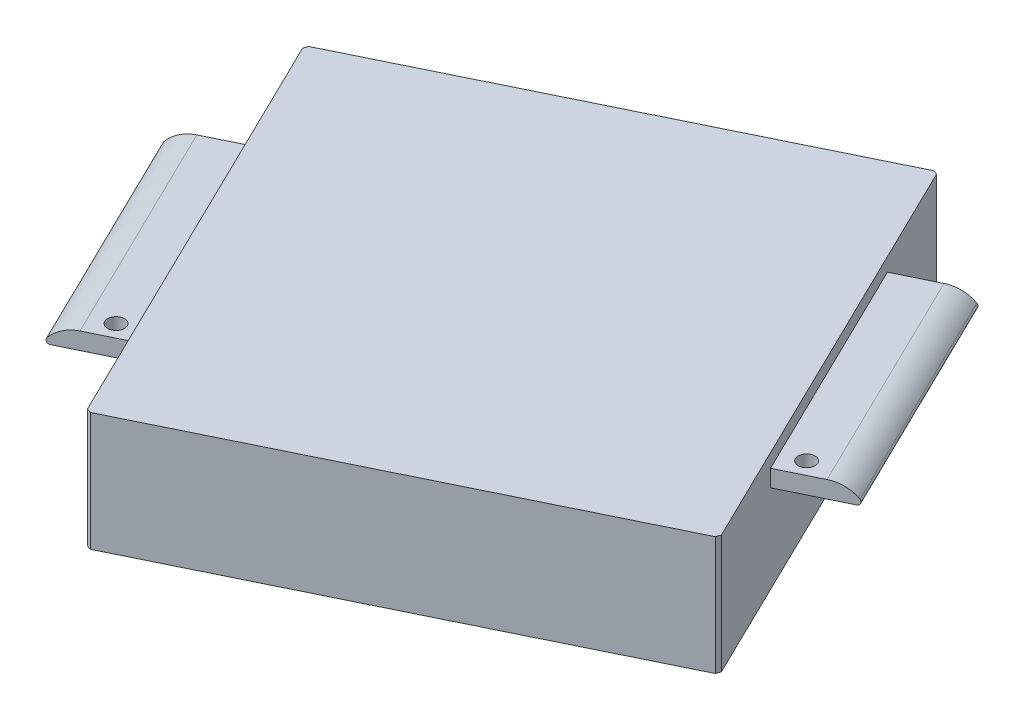
ISO-10303-21;
HEADER;
FILE_DESCRIPTION(('STEP AP214'),'2;1');
FILE_NAME('part.step','',(''),(''),'','','');
FILE_SCHEMA(('AUTOMOTIVE_DESIGN { 1 0 10303 214 1 1 1 1 }'));
ENDSEC;
DATA;
#1=APPLICATION_CONTEXT('core data for automotive mechanical design processes');
#2=APPLICATION_PROTOCOL_DEFINITION('international standard','automotive_design',2000,#1);
#3=PRODUCT_CONTEXT('',#1,'mechanical');
#4=PRODUCT('Part','Part','',(#3));
#5=PRODUCT_RELATED_PRODUCT_CATEGORY('part','',(#4));
#6=PRODUCT_DEFINITION_FORMATION('','',#4);
#7=PRODUCT_DEFINITION_CONTEXT('part definition',#1,'design');
#8=PRODUCT_DEFINITION('design','',#6,#7);
#9=PRODUCT_DEFINITION_SHAPE('','',#8);
#10=(LENGTH_UNIT() NAMED_UNIT(*) SI_UNIT(.MILLI.,.METRE.));
#11=(NAMED_UNIT(*) PLANE_ANGLE_UNIT() SI_UNIT($,.RADIAN.));
#12=(NAMED_UNIT(*) SI_UNIT($,.STERADIAN.) SOLID_ANGLE_UNIT());
#13=UNCERTAINTY_MEASURE_WITH_UNIT(LENGTH_MEASURE(1.E-05),#10,'distance_accuracy_value','');
#14=(GEOMETRIC_REPRESENTATION_CONTEXT(3) GLOBAL_UNCERTAINTY_ASSIGNED_CONTEXT((#13)) GLOBAL_UNIT_ASSIGNED_CONTEXT((#10,
#11,#12)) REPRESENTATION_CONTEXT('',''));
#15=CARTESIAN_POINT('',(0.,0.,0.));
#16=DIRECTION('',(0.,0.,1.));
#17=DIRECTION('',(1.,0.,0.));
#18=AXIS2_PLACEMENT_3D('',#15,#16,#17);
#19=CARTESIAN_POINT('',(-284.148360598406,940.,-1689.17348700061));
#20=DIRECTION('',(-0.898794046299167,0.,0.438371146789078));
#21=DIRECTION('',(0.438371146789078,0.,0.898794046299167));
#22=AXIS2_PLACEMENT_3D('',#19,#20,#21);
#23=PLANE('',#22);
#24=DIRECTION('',(-0.438371146789078,0.,-0.898794046299167));
#25=VECTOR('',#24,1.);
#26=CARTESIAN_POINT('',(-284.148360598406,870.,-1689.17348700061));
#27=LINE('',#26,#25);
#28=CARTESIAN_POINT('',(-284.148360598406,870.,-1689.17348700061));
#29=VERTEX_POINT('',#28);
#30=CARTESIAN_POINT('',(-405.138797112191,870.,-1937.24064377918));
#31=VERTEX_POINT('',#30);
#32=EDGE_CURVE('E235',#29,#31,#27,.T.);
#33=ORIENTED_EDGE('',*,*,#32,.F.);
#34=DIRECTION('',(0.,-1.,0.));
#35=VECTOR('',#34,1.);
#36=CARTESIAN_POINT('',(-284.148360598406,940.,-1689.17348700061));
#37=LINE('',#36,#35);
#38=CARTESIAN_POINT('',(-284.148360598406,940.,-1689.17348700061));
#39=VERTEX_POINT('',#38);
#40=EDGE_CURVE('E11',#39,#29,#37,.T.);
#41=ORIENTED_EDGE('',*,*,#40,.F.);
#42=DIRECTION('',(-0.438371146789078,0.,-0.898794046299167));
#43=VECTOR('',#42,1.);
#44=CARTESIAN_POINT('',(-284.148360598406,940.,-1689.17348700061));
#45=LINE('',#44,#43);
#46=CARTESIAN_POINT('',(-405.138797112191,940.,-1937.24064377918));
#47=VERTEX_POINT('',#46);
#48=EDGE_CURVE('E259',#39,#47,#45,.T.);
#49=ORIENTED_EDGE('',*,*,#48,.T.);
#50=DIRECTION('',(0.,-1.,0.));
#51=VECTOR('',#50,1.);
#52=CARTESIAN_POINT('',(-405.138797112191,940.,-1937.24064377918));
#53=LINE('',#52,#51);
#54=EDGE_CURVE('E25',#47,#31,#53,.T.);
#55=ORIENTED_EDGE('',*,*,#54,.T.);
#56=EDGE_LOOP('',(#33,#41,#49,#55));
#57=FACE_BOUND('',#56,.T.);
#58=DIRECTION('',(-0.438371146789077,0.,-0.898794046299167));
#59=VECTOR('',#58,1.);
#60=CARTESIAN_POINT('',(-311.765742846118,932.,-1745.79751191746));
#61=LINE('',#60,#59);
#62=CARTESIAN_POINT('',(-311.765742846118,932.,-1745.79751191746));
#63=VERTEX_POINT('',#62);
#64=CARTESIAN_POINT('',(-377.521414864479,932.,-1880.61661886233));
#65=VERTEX_POINT('',#64);
#66=EDGE_CURVE('E32',#63,#65,#61,.T.);
#67=ORIENTED_EDGE('',*,*,#66,.F.);
#68=DIRECTION('',(0.,-1.,0.));
#69=VECTOR('',#68,1.);
#70=CARTESIAN_POINT('',(-311.765742846118,932.,-1745.79751191746));
#71=LINE('',#70,#69);
#72=CARTESIAN_POINT('',(-311.765742846118,922.,-1745.79751191746));
#73=VERTEX_POINT('',#72);
#74=EDGE_CURVE('E36',#63,#73,#71,.T.);
#75=ORIENTED_EDGE('',*,*,#74,.T.);
#76=DIRECTION('',(-0.438371146789077,0.,-0.898794046299167));
#77=VECTOR('',#76,1.);
#78=CARTESIAN_POINT('',(-311.765742846118,922.,-1745.79751191746));
#79=LINE('',#78,#77);
#80=CARTESIAN_POINT('',(-377.521414864479,922.,-1880.61661886233));
#81=VERTEX_POINT('',#80);
#82=EDGE_CURVE('E136',#73,#81,#79,.T.);
#83=ORIENTED_EDGE('',*,*,#82,.T.);
#84=DIRECTION('',(0.,-1.,0.));
#85=VECTOR('',#84,1.);
#86=CARTESIAN_POINT('',(-377.521414864479,932.,-1880.61661886233));
#87=LINE('',#86,#85);
#88=EDGE_CURVE('E139',#65,#81,#87,.T.);
#89=ORIENTED_EDGE('',*,*,#88,.F.);
#90=EDGE_LOOP('',(#67,#75,#83,#89));
#91=FACE_BOUND('',#90,.T.);
#92=ADVANCED_FACE('F17',(#57,#91),#23,.T.);
#93=CARTESIAN_POINT('',(-281.474030212229,940.,-1688.25264120159));
#94=DIRECTION('',(-0.325568154457156,0.,0.945518575599317));
#95=DIRECTION('',(0.945518575599317,0.,0.325568154457156));
#96=AXIS2_PLACEMENT_3D('',#93,#94,#95);
#97=PLANE('',#96);
#98=DIRECTION('',(-0.945518575599317,0.,-0.325568154457156));
#99=VECTOR('',#98,1.);
#100=CARTESIAN_POINT('',(-281.474030212229,870.,-1688.25264120159));
#101=LINE('',#100,#99);
#102=CARTESIAN_POINT('',(-281.474030212229,870.,-1688.25264120159));
#103=VERTEX_POINT('',#102);
#104=EDGE_CURVE('E232',#103,#29,#101,.T.);
#105=ORIENTED_EDGE('',*,*,#104,.F.);
#106=DIRECTION('',(0.,-1.,0.));
#107=VECTOR('',#106,1.);
#108=CARTESIAN_POINT('',(-281.474030212229,940.,-1688.25264120159));
#109=LINE('',#108,#107);
#110=CARTESIAN_POINT('',(-281.474030212229,940.,-1688.25264120159));
#111=VERTEX_POINT('',#110);
#112=EDGE_CURVE('E280',#111,#103,#109,.T.);
#113=ORIENTED_EDGE('',*,*,#112,.F.);
#114=DIRECTION('',(-0.945518575599317,0.,-0.325568154457156));
#115=VECTOR('',#114,1.);
#116=CARTESIAN_POINT('',(-281.474030212229,940.,-1688.25264120159));
#117=LINE('',#116,#115);
#118=EDGE_CURVE('E256',#111,#39,#117,.T.);
#119=ORIENTED_EDGE('',*,*,#118,.T.);
#120=ORIENTED_EDGE('',*,*,#40,.T.);
#121=EDGE_LOOP('',(#105,#113,#119,#120));
#122=FACE_BOUND('',#121,.T.);
#123=ADVANCED_FACE('F19',(#122),#97,.T.);
#124=CARTESIAN_POINT('',(-405.138797112191,940.,-1937.24064377918));
#125=DIRECTION('',(-0.945518575599317,0.,-0.325568154457156));
#126=DIRECTION('',(-0.325568154457156,0.,0.945518575599317));
#127=AXIS2_PLACEMENT_3D('',#124,#125,#126);
#128=PLANE('',#127);
#129=DIRECTION('',(0.325568154457156,0.,-0.945518575599317));
#130=VECTOR('',#129,1.);
#131=CARTESIAN_POINT('',(-405.138797112191,870.,-1937.24064377918));
#132=LINE('',#131,#130);
#133=CARTESIAN_POINT('',(-404.217951313171,870.,-1939.91497416536));
#134=VERTEX_POINT('',#133);
#135=EDGE_CURVE('E238',#31,#134,#132,.T.);
#136=ORIENTED_EDGE('',*,*,#135,.F.);
#137=ORIENTED_EDGE('',*,*,#54,.F.);
#138=DIRECTION('',(0.325568154457156,0.,-0.945518575599317));
#139=VECTOR('',#138,1.);
#140=CARTESIAN_POINT('',(-405.138797112191,940.,-1937.24064377918));
#141=LINE('',#140,#139);
#142=CARTESIAN_POINT('',(-404.217951313171,940.,-1939.91497416536));
#143=VERTEX_POINT('',#142);
#144=EDGE_CURVE('E262',#47,#143,#141,.T.);
#145=ORIENTED_EDGE('',*,*,#144,.T.);
#146=DIRECTION('',(0.,-1.,0.));
#147=VECTOR('',#146,1.);
#148=CARTESIAN_POINT('',(-404.217951313171,940.,-1939.91497416536));
#149=LINE('',#148,#147);
#150=EDGE_CURVE('E292',#143,#134,#149,.T.);
#151=ORIENTED_EDGE('',*,*,#150,.T.);
#152=EDGE_LOOP('',(#136,#137,#145,#151));
#153=FACE_BOUND('',#152,.T.);
#154=ADVANCED_FACE('F299',(#153),#128,.T.);
#155=CARTESIAN_POINT('',(-404.217951313171,940.,-1939.91497416536));
#156=DIRECTION('',(-0.438371146789078,0.,-0.898794046299167));
#157=DIRECTION('',(-0.898794046299167,0.,0.438371146789078));
#158=AXIS2_PLACEMENT_3D('',#155,#156,#157);
#159=PLANE('',#158);
#160=DIRECTION('',(0.898794046299167,0.,-0.438371146789078));
#161=VECTOR('',#160,1.);
#162=CARTESIAN_POINT('',(-404.217951313171,870.,-1939.91497416536));
#163=LINE('',#162,#161);
#164=CARTESIAN_POINT('',(-156.150794534601,870.,-2060.90541067915));
#165=VERTEX_POINT('',#164);
#166=EDGE_CURVE('E241',#134,#165,#163,.T.);
#167=ORIENTED_EDGE('',*,*,#166,.F.);
#168=ORIENTED_EDGE('',*,*,#150,.F.);
#169=DIRECTION('',(0.898794046299167,0.,-0.438371146789078));
#170=VECTOR('',#169,1.);
#171=CARTESIAN_POINT('',(-404.217951313171,940.,-1939.91497416536));
#172=LINE('',#171,#170);
#173=CARTESIAN_POINT('',(-156.150794534601,940.,-2060.90541067915));
#174=VERTEX_POINT('',#173);
#175=EDGE_CURVE('E265',#143,#174,#172,.T.);
#176=ORIENTED_EDGE('',*,*,#175,.T.);
#177=DIRECTION('',(0.,-1.,0.));
#178=VECTOR('',#177,1.);
#179=CARTESIAN_POINT('',(-156.150794534601,940.,-2060.90541067915));
#180=LINE('',#179,#178);
#181=EDGE_CURVE('E290',#174,#165,#180,.T.);
#182=ORIENTED_EDGE('',*,*,#181,.T.);
#183=EDGE_LOOP('',(#167,#168,#176,#182));
#184=FACE_BOUND('',#183,.T.);
#185=ADVANCED_FACE('F314',(#184),#159,.T.);
#186=CARTESIAN_POINT('',(-156.150794534601,940.,-2060.90541067915));
#187=DIRECTION('',(0.325568154457156,0.,-0.945518575599317));
#188=DIRECTION('',(-0.945518575599317,0.,-0.325568154457156));
#189=AXIS2_PLACEMENT_3D('',#186,#187,#188);
#190=PLANE('',#189);
#191=DIRECTION('',(0.945518575599317,0.,0.325568154457156));
#192=VECTOR('',#191,1.);
#193=CARTESIAN_POINT('',(-156.150794534601,870.,-2060.90541067915));
#194=LINE('',#193,#192);
#195=CARTESIAN_POINT('',(-153.476464148424,870.,-2059.98456488012));
#196=VERTEX_POINT('',#195);
#197=EDGE_CURVE('E244',#165,#196,#194,.T.);
#198=ORIENTED_EDGE('',*,*,#197,.F.);
#199=ORIENTED_EDGE('',*,*,#181,.F.);
#200=DIRECTION('',(0.945518575599317,0.,0.325568154457156));
#201=VECTOR('',#200,1.);
#202=CARTESIAN_POINT('',(-156.150794534601,940.,-2060.90541067915));
#203=LINE('',#202,#201);
#204=CARTESIAN_POINT('',(-153.476464148424,940.,-2059.98456488012));
#205=VERTEX_POINT('',#204);
#206=EDGE_CURVE('E268',#174,#205,#203,.T.);
#207=ORIENTED_EDGE('',*,*,#206,.T.);
#208=DIRECTION('',(0.,-1.,0.));
#209=VECTOR('',#208,1.);
#210=CARTESIAN_POINT('',(-153.476464148424,940.,-2059.98456488012));
#211=LINE('',#210,#209);
#212=EDGE_CURVE('E288',#205,#196,#211,.T.);
#213=ORIENTED_EDGE('',*,*,#212,.T.);
#214=EDGE_LOOP('',(#198,#199,#207,#213));
#215=FACE_BOUND('',#214,.T.);
#216=ADVANCED_FACE('F318',(#215),#190,.T.);
#217=CARTESIAN_POINT('',(-153.476464148424,940.,-2059.98456488012));
#218=DIRECTION('',(0.898794046299167,0.,-0.438371146789078));
#219=DIRECTION('',(-0.438371146789078,0.,-0.898794046299167));
#220=AXIS2_PLACEMENT_3D('',#217,#218,#219);
#221=PLANE('',#220);
#222=DIRECTION('',(0.,-1.,0.));
#223=VECTOR('',#222,1.);
#224=CARTESIAN_POINT('',(-60.1034098823511,932.,-1868.5414330184));
#225=LINE('',#224,#223);
#226=CARTESIAN_POINT('',(-60.1034098823511,932.,-1868.5414330184));
#227=VERTEX_POINT('',#226);
#228=CARTESIAN_POINT('',(-60.1034098823512,922.,-1868.5414330184));
#229=VERTEX_POINT('',#228);
#230=EDGE_CURVE('E205',#227,#229,#225,.T.);
#231=ORIENTED_EDGE('',*,*,#230,.F.);
#232=DIRECTION('',(-0.438371146789078,0.,-0.898794046299167));
#233=VECTOR('',#232,1.);
#234=CARTESIAN_POINT('',(-60.1034098823511,932.,-1868.5414330184));
#235=LINE('',#234,#233);
#236=CARTESIAN_POINT('',(-125.859081900713,932.,-2003.36053996327));
#237=VERTEX_POINT('',#236);
#238=EDGE_CURVE('E230',#227,#237,#235,.T.);
#239=ORIENTED_EDGE('',*,*,#238,.T.);
#240=DIRECTION('',(0.,-1.,0.));
#241=VECTOR('',#240,1.);
#242=CARTESIAN_POINT('',(-125.859081900713,932.,-2003.36053996327));
#243=LINE('',#242,#241);
#244=CARTESIAN_POINT('',(-125.859081900713,922.,-2003.36053996327));
#245=VERTEX_POINT('',#244);
#246=EDGE_CURVE('E191',#237,#245,#243,.T.);
#247=ORIENTED_EDGE('',*,*,#246,.T.);
#248=DIRECTION('',(-0.438371146789078,0.,-0.898794046299167));
#249=VECTOR('',#248,1.);
#250=CARTESIAN_POINT('',(-60.1034098823511,922.,-1868.5414330184));
#251=LINE('',#250,#249);
#252=EDGE_CURVE('E227',#229,#245,#251,.T.);
#253=ORIENTED_EDGE('',*,*,#252,.F.);
#254=EDGE_LOOP('',(#231,#239,#247,#253));
#255=FACE_BOUND('',#254,.T.);
#256=DIRECTION('',(0.438371146789078,0.,0.898794046299167));
#257=VECTOR('',#256,1.);
#258=CARTESIAN_POINT('',(-153.476464148424,870.,-2059.98456488012));
#259=LINE('',#258,#257);
#260=CARTESIAN_POINT('',(-32.4860276346392,870.,-1811.91740810155));
#261=VERTEX_POINT('',#260);
#262=EDGE_CURVE('E247',#196,#261,#259,.T.);
#263=ORIENTED_EDGE('',*,*,#262,.F.);
#264=ORIENTED_EDGE('',*,*,#212,.F.);
#265=DIRECTION('',(0.438371146789078,0.,0.898794046299167));
#266=VECTOR('',#265,1.);
#267=CARTESIAN_POINT('',(-153.476464148424,940.,-2059.98456488012));
#268=LINE('',#267,#266);
#269=CARTESIAN_POINT('',(-32.4860276346392,940.,-1811.91740810155));
#270=VERTEX_POINT('',#269);
#271=EDGE_CURVE('E271',#205,#270,#268,.T.);
#272=ORIENTED_EDGE('',*,*,#271,.T.);
#273=DIRECTION('',(0.,-1.,0.));
#274=VECTOR('',#273,1.);
#275=CARTESIAN_POINT('',(-32.4860276346392,940.,-1811.91740810155));
#276=LINE('',#275,#274);
#277=EDGE_CURVE('E286',#270,#261,#276,.T.);
#278=ORIENTED_EDGE('',*,*,#277,.T.);
#279=EDGE_LOOP('',(#263,#264,#272,#278));
#280=FACE_BOUND('',#279,.T.);
#281=ADVANCED_FACE('F320',(#255,#280),#221,.T.);
#282=CARTESIAN_POINT('',(-32.4860276346392,940.,-1811.91740810155));
#283=DIRECTION('',(0.945518575599317,0.,0.325568154457156));
#284=DIRECTION('',(0.325568154457156,0.,-0.945518575599317));
#285=AXIS2_PLACEMENT_3D('',#282,#283,#284);
#286=PLANE('',#285);
#287=DIRECTION('',(-0.325568154457156,0.,0.945518575599317));
#288=VECTOR('',#287,1.);
#289=CARTESIAN_POINT('',(-32.4860276346392,870.,-1811.91740810155));
#290=LINE('',#289,#288);
#291=CARTESIAN_POINT('',(-33.4068734336594,870.,-1809.24307771538));
#292=VERTEX_POINT('',#291);
#293=EDGE_CURVE('E250',#261,#292,#290,.T.);
#294=ORIENTED_EDGE('',*,*,#293,.F.);
#295=ORIENTED_EDGE('',*,*,#277,.F.);
#296=DIRECTION('',(-0.325568154457156,0.,0.945518575599317));
#297=VECTOR('',#296,1.);
#298=CARTESIAN_POINT('',(-32.4860276346392,940.,-1811.91740810155));
#299=LINE('',#298,#297);
#300=CARTESIAN_POINT('',(-33.4068734336594,940.,-1809.24307771538));
#301=VERTEX_POINT('',#300);
#302=EDGE_CURVE('E274',#270,#301,#299,.T.);
#303=ORIENTED_EDGE('',*,*,#302,.T.);
#304=DIRECTION('',(0.,-1.,0.));
#305=VECTOR('',#304,1.);
#306=CARTESIAN_POINT('',(-33.4068734336594,940.,-1809.24307771538));
#307=LINE('',#306,#305);
#308=EDGE_CURVE('E284',#301,#292,#307,.T.);
#309=ORIENTED_EDGE('',*,*,#308,.T.);
#310=EDGE_LOOP('',(#294,#295,#303,#309));
#311=FACE_BOUND('',#310,.T.);
#312=ADVANCED_FACE('F324',(#311),#286,.T.);
#313=CARTESIAN_POINT('',(-33.4068734336594,940.,-1809.24307771538));
#314=DIRECTION('',(0.438371146789078,0.,0.898794046299167));
#315=DIRECTION('',(0.898794046299167,0.,-0.438371146789078));
#316=AXIS2_PLACEMENT_3D('',#313,#314,#315);
#317=PLANE('',#316);
#318=DIRECTION('',(-0.898794046299167,0.,0.438371146789078));
#319=VECTOR('',#318,1.);
#320=CARTESIAN_POINT('',(-33.4068734336594,870.,-1809.24307771538));
#321=LINE('',#320,#319);
#322=EDGE_CURVE('E253',#292,#103,#321,.T.);
#323=ORIENTED_EDGE('',*,*,#322,.F.);
#324=ORIENTED_EDGE('',*,*,#308,.F.);
#325=DIRECTION('',(-0.898794046299167,0.,0.438371146789078));
#326=VECTOR('',#325,1.);
#327=CARTESIAN_POINT('',(-33.4068734336594,940.,-1809.24307771538));
#328=LINE('',#327,#326);
#329=EDGE_CURVE('E277',#301,#111,#328,.T.);
#330=ORIENTED_EDGE('',*,*,#329,.T.);
#331=ORIENTED_EDGE('',*,*,#112,.T.);
#332=EDGE_LOOP('',(#323,#324,#330,#331));
#333=FACE_BOUND('',#332,.T.);
#334=ADVANCED_FACE('F326',(#333),#317,.T.);
#335=CARTESIAN_POINT('',(-468.677157244584,940.,-1752.711847133));
#336=DIRECTION('',(0.,-1.,0.));
#337=DIRECTION('',(-0.898794046299167,0.,0.438371146789078));
#338=AXIS2_PLACEMENT_3D('',#335,#336,#337);
#339=PLANE('',#338);
#340=ORIENTED_EDGE('',*,*,#118,.F.);
#341=ORIENTED_EDGE('',*,*,#329,.F.);
#342=ORIENTED_EDGE('',*,*,#302,.F.);
#343=ORIENTED_EDGE('',*,*,#271,.F.);
#344=ORIENTED_EDGE('',*,*,#206,.F.);
#345=ORIENTED_EDGE('',*,*,#175,.F.);
#346=ORIENTED_EDGE('',*,*,#144,.F.);
#347=ORIENTED_EDGE('',*,*,#48,.F.);
#348=EDGE_LOOP('',(#340,#341,#342,#343,#344,#345,#346,#347));
#349=FACE_BOUND('',#348,.T.);
#350=ADVANCED_FACE('F308',(#349),#339,.F.);
#351=CARTESIAN_POINT('',(-468.677157244584,870.,-1752.711847133));
#352=DIRECTION('',(0.,-1.,0.));
#353=DIRECTION('',(-0.898794046299167,0.,0.438371146789078));
#354=AXIS2_PLACEMENT_3D('',#351,#352,#353);
#355=PLANE('',#354);
#356=ORIENTED_EDGE('',*,*,#104,.T.);
#357=ORIENTED_EDGE('',*,*,#32,.T.);
#358=ORIENTED_EDGE('',*,*,#135,.T.);
#359=ORIENTED_EDGE('',*,*,#166,.T.);
#360=ORIENTED_EDGE('',*,*,#197,.T.);
#361=ORIENTED_EDGE('',*,*,#262,.T.);
#362=ORIENTED_EDGE('',*,*,#293,.T.);
#363=ORIENTED_EDGE('',*,*,#322,.T.);
#364=EDGE_LOOP('',(#356,#357,#358,#359,#360,#361,#362,#363));
#365=FACE_BOUND('',#364,.T.);
#366=ADVANCED_FACE('F302',(#365),#355,.T.);
#367=CARTESIAN_POINT('',(-37.6335587248743,932.,-1879.50071168813));
#368=DIRECTION('',(0.,1.,0.));
#369=DIRECTION('',(0.898794046299167,0.,-0.438371146789078));
#370=AXIS2_PLACEMENT_3D('',#367,#368,#369);
#371=PLANE('',#370);
#372=CARTESIAN_POINT('',(-53.2521957715023,932.,-1883.00901281626));
#373=DIRECTION('',(0.,1.,0.));
#374=DIRECTION('',(0.898794046299167,0.,-0.438371146789078));
#375=AXIS2_PLACEMENT_3D('',#372,#373,#374);
#376=CIRCLE('',#375,5.);
#377=CARTESIAN_POINT('',(-48.7582255400065,932.,-1885.2008685502));
#378=VERTEX_POINT('',#377);
#379=EDGE_CURVE('E185',#378,#378,#376,.T.);
#380=ORIENTED_EDGE('',*,*,#379,.F.);
#381=EDGE_LOOP('',(#380));
#382=FACE_BOUND('',#381,.T.);
#383=DIRECTION('',(-0.898794046299167,0.,0.438371146789078));
#384=VECTOR('',#383,1.);
#385=CARTESIAN_POINT('',(-103.389230743236,932.,-2014.319818633));
#386=LINE('',#385,#384);
#387=CARTESIAN_POINT('',(-103.389230743236,932.,-2014.319818633));
#388=VERTEX_POINT('',#387);
#389=EDGE_CURVE('E194',#388,#237,#386,.T.);
#390=ORIENTED_EDGE('',*,*,#389,.T.);
#391=ORIENTED_EDGE('',*,*,#238,.F.);
#392=DIRECTION('',(-0.898794046299167,0.,0.438371146789078));
#393=VECTOR('',#392,1.);
#394=CARTESIAN_POINT('',(-37.6335587248743,932.,-1879.50071168813));
#395=LINE('',#394,#393);
#396=CARTESIAN_POINT('',(-37.6335587248744,932.,-1879.50071168812));
#397=VERTEX_POINT('',#396);
#398=EDGE_CURVE('E202',#397,#227,#395,.T.);
#399=ORIENTED_EDGE('',*,*,#398,.F.);
#400=DIRECTION('',(-0.438371146789078,0.,-0.898794046299167));
#401=VECTOR('',#400,1.);
#402=CARTESIAN_POINT('',(-37.6335587248744,932.,-1879.50071168812));
#403=LINE('',#402,#401);
#404=EDGE_CURVE('E216',#397,#388,#403,.T.);
#405=ORIENTED_EDGE('',*,*,#404,.T.);
#406=EDGE_LOOP('',(#390,#391,#399,#405));
#407=FACE_BOUND('',#406,.T.);
#408=ADVANCED_FACE('F359',(#382,#407),#371,.T.);
#409=CARTESIAN_POINT('',(-60.1034098823511,922.,-1868.5414330184));
#410=DIRECTION('',(0.,-1.,0.));
#411=DIRECTION('',(-0.898794046299167,0.,0.438371146789078));
#412=AXIS2_PLACEMENT_3D('',#409,#410,#411);
#413=PLANE('',#412);
#414=CARTESIAN_POINT('',(-53.2521957715023,922.,-1883.00901281626));
#415=DIRECTION('',(0.,1.,0.));
#416=DIRECTION('',(-0.898794046299167,0.,0.438371146789077));
#417=AXIS2_PLACEMENT_3D('',#414,#415,#416);
#418=CIRCLE('',#417,5.);
#419=CARTESIAN_POINT('',(-57.7461660029981,922.,-1880.81715708231));
#420=VERTEX_POINT('',#419);
#421=EDGE_CURVE('E190',#420,#420,#418,.T.);
#422=ORIENTED_EDGE('',*,*,#421,.T.);
#423=EDGE_LOOP('',(#422));
#424=FACE_BOUND('',#423,.T.);
#425=DIRECTION('',(0.898794046299167,0.,-0.438371146789078));
#426=VECTOR('',#425,1.);
#427=CARTESIAN_POINT('',(-125.859081900713,922.,-2003.36053996327));
#428=LINE('',#427,#426);
#429=CARTESIAN_POINT('',(-91.7049081413442,922.,-2020.01864354126));
#430=VERTEX_POINT('',#429);
#431=EDGE_CURVE('E193',#245,#430,#428,.T.);
#432=ORIENTED_EDGE('',*,*,#431,.T.);
#433=DIRECTION('',(-0.438371146789078,0.,-0.898794046299167));
#434=VECTOR('',#433,1.);
#435=CARTESIAN_POINT('',(-25.9492361229827,922.,-1885.19953659638));
#436=LINE('',#435,#434);
#437=CARTESIAN_POINT('',(-25.9492361229827,922.,-1885.19953659638));
#438=VERTEX_POINT('',#437);
#439=EDGE_CURVE('E224',#438,#430,#436,.T.);
#440=ORIENTED_EDGE('',*,*,#439,.F.);
#441=DIRECTION('',(0.898794046299167,0.,-0.438371146789078));
#442=VECTOR('',#441,1.);
#443=CARTESIAN_POINT('',(-60.1034098823511,922.,-1868.5414330184));
#444=LINE('',#443,#442);
#445=EDGE_CURVE('E208',#229,#438,#444,.T.);
#446=ORIENTED_EDGE('',*,*,#445,.F.);
#447=ORIENTED_EDGE('',*,*,#252,.T.);
#448=EDGE_LOOP('',(#432,#440,#446,#447));
#449=FACE_BOUND('',#448,.T.);
#450=ADVANCED_FACE('F366',(#424,#449),#413,.T.);
#451=CARTESIAN_POINT('',(-25.9492361229828,924.,-1885.19953659638));
#452=DIRECTION('',(-0.438371146789078,0.,-0.898794046299167));
#453=DIRECTION('',(-0.898794046299167,0.,0.438371146789078));
#454=AXIS2_PLACEMENT_3D('',#451,#452,#453);
#455=CYLINDRICAL_SURFACE('',#454,2.);
#456=CARTESIAN_POINT('',(-91.7049081413442,924.,-2020.01864354126));
#457=DIRECTION('',(0.438371146789078,0.,0.898794046299167));
#458=DIRECTION('',(0.,-1.,0.));
#459=AXIS2_PLACEMENT_3D('',#456,#457,#458);
#460=CIRCLE('',#459,2.);
#461=CARTESIAN_POINT('',(-90.3343514305665,925.294113061495,-2020.68710871359));
#462=VERTEX_POINT('',#461);
#463=EDGE_CURVE('E197',#430,#462,#460,.T.);
#464=ORIENTED_EDGE('',*,*,#463,.T.);
#465=DIRECTION('',(-0.438371146789078,0.,-0.898794046299167));
#466=VECTOR('',#465,1.);
#467=CARTESIAN_POINT('',(-24.5786794122051,925.294113061495,-1885.86800176871));
#468=LINE('',#467,#466);
#469=CARTESIAN_POINT('',(-24.5786794122051,925.294113061495,-1885.86800176871));
#470=VERTEX_POINT('',#469);
#471=EDGE_CURVE('E221',#470,#462,#468,.T.);
#472=ORIENTED_EDGE('',*,*,#471,.F.);
#473=CARTESIAN_POINT('',(-25.9492361229828,924.,-1885.19953659638));
#474=DIRECTION('',(0.438371146789078,0.,0.898794046299167));
#475=DIRECTION('',(0.,-1.,0.));
#476=AXIS2_PLACEMENT_3D('',#473,#474,#475);
#477=CIRCLE('',#476,2.);
#478=EDGE_CURVE('E211',#438,#470,#477,.T.);
#479=ORIENTED_EDGE('',*,*,#478,.F.);
#480=ORIENTED_EDGE('',*,*,#439,.T.);
#481=EDGE_LOOP('',(#464,#472,#479,#480));
#482=FACE_BOUND('',#481,.T.);
#483=ADVANCED_FACE('F369',(#482),#455,.T.);
#484=CARTESIAN_POINT('',(-37.5989681645936,913.000038977292,-1879.51758263164));
#485=DIRECTION('',(-0.438371146789078,0.,-0.898794046299167));
#486=DIRECTION('',(-0.898794046299167,0.,0.438371146789078));
#487=AXIS2_PLACEMENT_3D('',#484,#485,#486);
#488=CYLINDRICAL_SURFACE('',#487,19.);
#489=CARTESIAN_POINT('',(-103.354640182955,913.000038977292,-2014.33668957651));
#490=DIRECTION('',(0.438371146789077,0.,0.898794046299168));
#491=DIRECTION('',(-0.00182055580411801,0.999997948563554,0.000887944394972317));
#492=AXIS2_PLACEMENT_3D('',#489,#490,#491);
#493=CIRCLE('',#492,19.);
#494=EDGE_CURVE('E200',#462,#388,#493,.T.);
#495=ORIENTED_EDGE('',*,*,#494,.T.);
#496=ORIENTED_EDGE('',*,*,#404,.F.);
#497=CARTESIAN_POINT('',(-37.5989681645936,913.000038977292,-1879.51758263164));
#498=DIRECTION('',(0.438371146789077,0.,0.898794046299168));
#499=DIRECTION('',(-0.00182055580411801,0.999997948563554,0.000887944394972317));
#500=AXIS2_PLACEMENT_3D('',#497,#498,#499);
#501=CIRCLE('',#500,19.);
#502=EDGE_CURVE('E214',#470,#397,#501,.T.);
#503=ORIENTED_EDGE('',*,*,#502,.F.);
#504=ORIENTED_EDGE('',*,*,#471,.T.);
#505=EDGE_LOOP('',(#495,#496,#503,#504));
#506=FACE_BOUND('',#505,.T.);
#507=ADVANCED_FACE('F371',(#506),#488,.T.);
#508=CARTESIAN_POINT('',(-25.9492361229828,924.,-1885.19953659638));
#509=DIRECTION('',(-0.438371146789078,0.,-0.898794046299167));
#510=DIRECTION('',(-0.898794046299167,0.,0.438371146789078));
#511=AXIS2_PLACEMENT_3D('',#508,#509,#510);
#512=PLANE('',#511);
#513=ORIENTED_EDGE('',*,*,#398,.T.);
#514=ORIENTED_EDGE('',*,*,#230,.T.);
#515=ORIENTED_EDGE('',*,*,#445,.T.);
#516=ORIENTED_EDGE('',*,*,#478,.T.);
#517=ORIENTED_EDGE('',*,*,#502,.T.);
#518=EDGE_LOOP('',(#513,#514,#515,#516,#517));
#519=FACE_BOUND('',#518,.T.);
#520=ADVANCED_FACE('F356',(#519),#512,.F.);
#521=CARTESIAN_POINT('',(-91.7049081413442,924.,-2020.01864354126));
#522=DIRECTION('',(-0.438371146789078,0.,-0.898794046299167));
#523=DIRECTION('',(-0.898794046299167,0.,0.438371146789078));
#524=AXIS2_PLACEMENT_3D('',#521,#522,#523);
#525=PLANE('',#524);
#526=ORIENTED_EDGE('',*,*,#389,.F.);
#527=ORIENTED_EDGE('',*,*,#494,.F.);
#528=ORIENTED_EDGE('',*,*,#463,.F.);
#529=ORIENTED_EDGE('',*,*,#431,.F.);
#530=ORIENTED_EDGE('',*,*,#246,.F.);
#531=EDGE_LOOP('',(#526,#527,#528,#529,#530));
#532=FACE_BOUND('',#531,.T.);
#533=ADVANCED_FACE('F362',(#532),#525,.T.);
#534=CARTESIAN_POINT('',(-53.2521957715023,916.999999999951,-1883.00901281626));
#535=DIRECTION('',(0.,1.,0.));
#536=DIRECTION('',(0.898794046299167,0.,-0.438371146789078));
#537=AXIS2_PLACEMENT_3D('',#534,#535,#536);
#538=CYLINDRICAL_SURFACE('',#537,5.);
#539=ORIENTED_EDGE('',*,*,#421,.F.);
#540=EDGE_LOOP('',(#539));
#541=FACE_BOUND('',#540,.T.);
#542=ORIENTED_EDGE('',*,*,#379,.T.);
#543=EDGE_LOOP('',(#542));
#544=FACE_BOUND('',#543,.T.);
#545=ADVANCED_FACE('F434',(#541,#544),#538,.F.);
#546=CARTESIAN_POINT('',(-334.235594003595,932.,-1734.83823324773));
#547=DIRECTION('',(0.,1.,0.));
#548=DIRECTION('',(-0.898794046299167,0.,0.438371146789077));
#549=AXIS2_PLACEMENT_3D('',#546,#547,#548);
#550=PLANE('',#549);
#551=CARTESIAN_POINT('',(-327.384379892748,932.,-1749.30581304559));
#552=DIRECTION('',(0.,-1.,0.));
#553=DIRECTION('',(-0.898794046299167,0.,0.438371146789078));
#554=AXIS2_PLACEMENT_3D('',#551,#552,#553);
#555=CIRCLE('',#554,5.);
#556=CARTESIAN_POINT('',(-331.878350124244,932.,-1747.11395731164));
#557=VERTEX_POINT('',#556);
#558=EDGE_CURVE('E162',#557,#557,#555,.T.);
#559=ORIENTED_EDGE('',*,*,#558,.T.);
#560=EDGE_LOOP('',(#559));
#561=FACE_BOUND('',#560,.T.);
#562=DIRECTION('',(0.898794046299167,0.,-0.438371146789077));
#563=VECTOR('',#562,1.);
#564=CARTESIAN_POINT('',(-399.991266021957,932.,-1869.65734019261));
#565=LINE('',#564,#563);
#566=CARTESIAN_POINT('',(-399.991266021957,932.,-1869.65734019261));
#567=VERTEX_POINT('',#566);
#568=EDGE_CURVE('E157',#567,#65,#565,.T.);
#569=ORIENTED_EDGE('',*,*,#568,.F.);
#570=DIRECTION('',(-0.438371146789077,0.,-0.898794046299167));
#571=VECTOR('',#570,1.);
#572=CARTESIAN_POINT('',(-334.235594003595,932.,-1734.83823324773));
#573=LINE('',#572,#571);
#574=CARTESIAN_POINT('',(-334.235594003595,932.,-1734.83823324773));
#575=VERTEX_POINT('',#574);
#576=EDGE_CURVE('E177',#575,#567,#573,.T.);
#577=ORIENTED_EDGE('',*,*,#576,.F.);
#578=DIRECTION('',(0.898794046299167,0.,-0.438371146789077));
#579=VECTOR('',#578,1.);
#580=CARTESIAN_POINT('',(-334.235594003595,932.,-1734.83823324773));
#581=LINE('',#580,#579);
#582=EDGE_CURVE('E166',#575,#63,#581,.T.);
#583=ORIENTED_EDGE('',*,*,#582,.T.);
#584=ORIENTED_EDGE('',*,*,#66,.T.);
#585=EDGE_LOOP('',(#569,#577,#583,#584));
#586=FACE_BOUND('',#585,.T.);
#587=ADVANCED_FACE('F442',(#561,#586),#550,.T.);
#588=CARTESIAN_POINT('',(-311.765742846118,922.,-1745.79751191746));
#589=DIRECTION('',(0.,-1.,0.));
#590=DIRECTION('',(0.898794046299167,0.,-0.438371146789077));
#591=AXIS2_PLACEMENT_3D('',#588,#589,#590);
#592=PLANE('',#591);
#593=CARTESIAN_POINT('',(-327.384379892748,922.,-1749.30581304559));
#594=DIRECTION('',(0.,-1.,0.));
#595=DIRECTION('',(0.898794046299167,0.,-0.438371146789078));
#596=AXIS2_PLACEMENT_3D('',#593,#594,#595);
#597=CIRCLE('',#596,5.);
#598=CARTESIAN_POINT('',(-322.890409661252,922.,-1751.49766877954));
#599=VERTEX_POINT('',#598);
#600=EDGE_CURVE('E159',#599,#599,#597,.T.);
#601=ORIENTED_EDGE('',*,*,#600,.F.);
#602=EDGE_LOOP('',(#601));
#603=FACE_BOUND('',#602,.T.);
#604=DIRECTION('',(-0.898794046299167,0.,0.438371146789077));
#605=VECTOR('',#604,1.);
#606=CARTESIAN_POINT('',(-377.521414864479,922.,-1880.61661886233));
#607=LINE('',#606,#605);
#608=CARTESIAN_POINT('',(-411.675588623848,922.,-1863.95851528435));
#609=VERTEX_POINT('',#608);
#610=EDGE_CURVE('E146',#81,#609,#607,.T.);
#611=ORIENTED_EDGE('',*,*,#610,.F.);
#612=ORIENTED_EDGE('',*,*,#82,.F.);
#613=DIRECTION('',(-0.898794046299167,0.,0.438371146789077));
#614=VECTOR('',#613,1.);
#615=CARTESIAN_POINT('',(-311.765742846118,922.,-1745.79751191746));
#616=LINE('',#615,#614);
#617=CARTESIAN_POINT('',(-345.919916605486,922.,-1729.13940833947));
#618=VERTEX_POINT('',#617);
#619=EDGE_CURVE('E169',#73,#618,#616,.T.);
#620=ORIENTED_EDGE('',*,*,#619,.T.);
#621=DIRECTION('',(-0.438371146789077,0.,-0.898794046299167));
#622=VECTOR('',#621,1.);
#623=CARTESIAN_POINT('',(-345.919916605486,922.,-1729.13940833947));
#624=LINE('',#623,#622);
#625=EDGE_CURVE('E143',#618,#609,#624,.T.);
#626=ORIENTED_EDGE('',*,*,#625,.T.);
#627=EDGE_LOOP('',(#611,#612,#620,#626));
#628=FACE_BOUND('',#627,.T.);
#629=ADVANCED_FACE('F147',(#603,#628),#592,.T.);
#630=CARTESIAN_POINT('',(-345.919916605486,924.,-1729.13940833947));
#631=DIRECTION('',(-0.438371146789077,0.,-0.898794046299167));
#632=DIRECTION('',(0.898794046299167,0.,-0.438371146789077));
#633=AXIS2_PLACEMENT_3D('',#630,#631,#632);
#634=CYLINDRICAL_SURFACE('',#633,2.);
#635=CARTESIAN_POINT('',(-411.675588623848,924.,-1863.95851528435));
#636=DIRECTION('',(-0.438371146789077,0.,-0.898794046299167));
#637=DIRECTION('',(0.,-1.,0.));
#638=AXIS2_PLACEMENT_3D('',#635,#636,#637);
#639=CIRCLE('',#638,2.);
#640=CARTESIAN_POINT('',(-413.046145334625,925.294113061495,-1863.29005011203));
#641=VERTEX_POINT('',#640);
#642=EDGE_CURVE('E151',#609,#641,#639,.T.);
#643=ORIENTED_EDGE('',*,*,#642,.F.);
#644=ORIENTED_EDGE('',*,*,#625,.F.);
#645=CARTESIAN_POINT('',(-345.919916605486,924.,-1729.13940833947));
#646=DIRECTION('',(-0.438371146789077,0.,-0.898794046299167));
#647=DIRECTION('',(0.,-1.,0.));
#648=AXIS2_PLACEMENT_3D('',#645,#646,#647);
#649=CIRCLE('',#648,2.);
#650=CARTESIAN_POINT('',(-347.290473316264,925.294113061495,-1728.47094316715));
#651=VERTEX_POINT('',#650);
#652=EDGE_CURVE('E171',#618,#651,#649,.T.);
#653=ORIENTED_EDGE('',*,*,#652,.T.);
#654=DIRECTION('',(-0.438371146789077,0.,-0.898794046299167));
#655=VECTOR('',#654,1.);
#656=CARTESIAN_POINT('',(-347.290473316264,925.294113061495,-1728.47094316715));
#657=LINE('',#656,#655);
#658=EDGE_CURVE('E181',#651,#641,#657,.T.);
#659=ORIENTED_EDGE('',*,*,#658,.T.);
#660=EDGE_LOOP('',(#643,#644,#653,#659));
#661=FACE_BOUND('',#660,.T.);
#662=ADVANCED_FACE('F461',(#661),#634,.T.);
#663=CARTESIAN_POINT('',(-334.270184563876,913.000038977292,-1734.82136230423));
#664=DIRECTION('',(-0.438371146789077,0.,-0.898794046299167));
#665=DIRECTION('',(0.898794046299167,0.,-0.438371146789077));
#666=AXIS2_PLACEMENT_3D('',#663,#664,#665);
#667=CYLINDRICAL_SURFACE('',#666,19.);
#668=CARTESIAN_POINT('',(-400.025856582237,913.000038977292,-1869.6404692491));
#669=DIRECTION('',(-0.438371146789078,0.,-0.898794046299167));
#670=DIRECTION('',(0.00182055580411913,0.999997948563554,-0.000887944394970388));
#671=AXIS2_PLACEMENT_3D('',#668,#669,#670);
#672=CIRCLE('',#671,19.);
#673=EDGE_CURVE('E165',#641,#567,#672,.T.);
#674=ORIENTED_EDGE('',*,*,#673,.F.);
#675=ORIENTED_EDGE('',*,*,#658,.F.);
#676=CARTESIAN_POINT('',(-334.270184563876,913.000038977292,-1734.82136230423));
#677=DIRECTION('',(-0.438371146789078,0.,-0.898794046299167));
#678=DIRECTION('',(0.00182055580411913,0.999997948563554,-0.000887944394970388));
#679=AXIS2_PLACEMENT_3D('',#676,#677,#678);
#680=CIRCLE('',#679,19.);
#681=EDGE_CURVE('E174',#651,#575,#680,.T.);
#682=ORIENTED_EDGE('',*,*,#681,.T.);
#683=ORIENTED_EDGE('',*,*,#576,.T.);
#684=EDGE_LOOP('',(#674,#675,#682,#683));
#685=FACE_BOUND('',#684,.T.);
#686=ADVANCED_FACE('F471',(#685),#667,.T.);
#687=CARTESIAN_POINT('',(-345.919916605486,924.,-1729.13940833947));
#688=DIRECTION('',(-0.438371146789077,0.,-0.898794046299167));
#689=DIRECTION('',(0.898794046299167,0.,-0.438371146789077));
#690=AXIS2_PLACEMENT_3D('',#687,#688,#689);
#691=PLANE('',#690);
#692=ORIENTED_EDGE('',*,*,#582,.F.);
#693=ORIENTED_EDGE('',*,*,#681,.F.);
#694=ORIENTED_EDGE('',*,*,#652,.F.);
#695=ORIENTED_EDGE('',*,*,#619,.F.);
#696=ORIENTED_EDGE('',*,*,#74,.F.);
#697=EDGE_LOOP('',(#692,#693,#694,#695,#696));
#698=FACE_BOUND('',#697,.T.);
#699=ADVANCED_FACE('F481',(#698),#691,.F.);
#700=CARTESIAN_POINT('',(-411.675588623848,924.,-1863.95851528435));
#701=DIRECTION('',(-0.438371146789077,0.,-0.898794046299167));
#702=DIRECTION('',(0.898794046299167,0.,-0.438371146789077));
#703=AXIS2_PLACEMENT_3D('',#700,#701,#702);
#704=PLANE('',#703);
#705=ORIENTED_EDGE('',*,*,#568,.T.);
#706=ORIENTED_EDGE('',*,*,#88,.T.);
#707=ORIENTED_EDGE('',*,*,#610,.T.);
#708=ORIENTED_EDGE('',*,*,#642,.T.);
#709=ORIENTED_EDGE('',*,*,#673,.T.);
#710=EDGE_LOOP('',(#705,#706,#707,#708,#709));
#711=FACE_BOUND('',#710,.T.);
#712=ADVANCED_FACE('F154',(#711),#704,.T.);
#713=CARTESIAN_POINT('',(-327.384379892748,916.999999999951,-1749.30581304559));
#714=DIRECTION('',(0.,1.,0.));
#715=DIRECTION('',(-0.898794046299167,0.,0.438371146789078));
#716=AXIS2_PLACEMENT_3D('',#713,#714,#715);
#717=CYLINDRICAL_SURFACE('',#716,5.);
#718=ORIENTED_EDGE('',*,*,#600,.T.);
#719=EDGE_LOOP('',(#718));
#720=FACE_BOUND('',#719,.T.);
#721=ORIENTED_EDGE('',*,*,#558,.F.);
#722=EDGE_LOOP('',(#721));
#723=FACE_BOUND('',#722,.T.);
#724=ADVANCED_FACE('F500',(#720,#723),#717,.F.);
#725=CLOSED_SHELL('',(#92,#123,#154,#185,#216,#281,#312,#334,#350,#366,#408,#450,#483,#507,#520,
#533,#545,#587,#629,#662,#686,#699,#712,#724));
#726=MANIFOLD_SOLID_BREP('B1',#725);
#727=ADVANCED_BREP_SHAPE_REPRESENTATION('',(#18,#726),#14);
#728=SHAPE_DEFINITION_REPRESENTATION(#9,#727);
ENDSEC;
END-ISO-10303-21;
